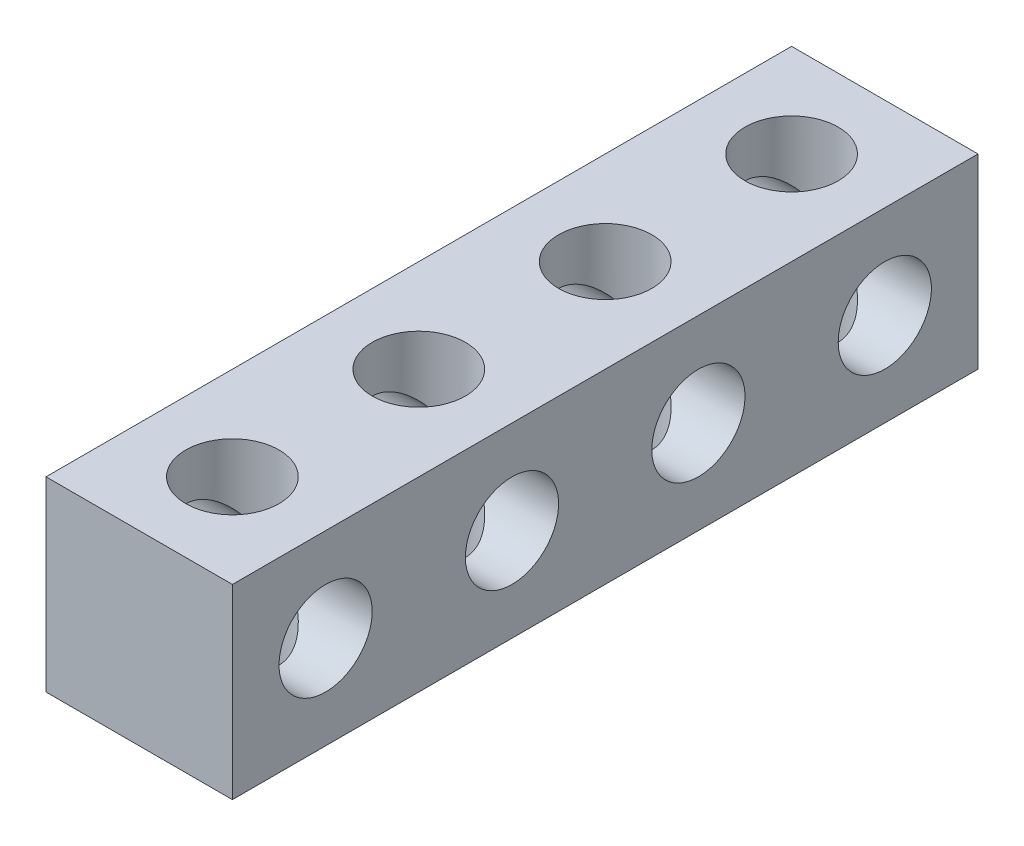
ISO-10303-21;
HEADER;
FILE_DESCRIPTION(('STEP AP214'),'2;1');
FILE_NAME('part.step','',(''),(''),'','','');
FILE_SCHEMA(('AUTOMOTIVE_DESIGN { 1 0 10303 214 1 1 1 1 }'));
ENDSEC;
DATA;
#1=APPLICATION_CONTEXT('core data for automotive mechanical design processes');
#2=APPLICATION_PROTOCOL_DEFINITION('international standard','automotive_design',2000,#1);
#3=PRODUCT_CONTEXT('',#1,'mechanical');
#4=PRODUCT('Part','Part','',(#3));
#5=PRODUCT_RELATED_PRODUCT_CATEGORY('part','',(#4));
#6=PRODUCT_DEFINITION_FORMATION('','',#4);
#7=PRODUCT_DEFINITION_CONTEXT('part definition',#1,'design');
#8=PRODUCT_DEFINITION('design','',#6,#7);
#9=PRODUCT_DEFINITION_SHAPE('','',#8);
#10=(LENGTH_UNIT() NAMED_UNIT(*) SI_UNIT(.MILLI.,.METRE.));
#11=(NAMED_UNIT(*) PLANE_ANGLE_UNIT() SI_UNIT($,.RADIAN.));
#12=(NAMED_UNIT(*) SI_UNIT($,.STERADIAN.) SOLID_ANGLE_UNIT());
#13=UNCERTAINTY_MEASURE_WITH_UNIT(LENGTH_MEASURE(1.E-05),#10,'distance_accuracy_value','');
#14=(GEOMETRIC_REPRESENTATION_CONTEXT(3) GLOBAL_UNCERTAINTY_ASSIGNED_CONTEXT((#13)) GLOBAL_UNIT_ASSIGNED_CONTEXT((#10,
#11,#12)) REPRESENTATION_CONTEXT('',''));
#15=CARTESIAN_POINT('',(0.,0.,0.));
#16=DIRECTION('',(0.,0.,1.));
#17=DIRECTION('',(1.,0.,0.));
#18=AXIS2_PLACEMENT_3D('',#15,#16,#17);
#19=CARTESIAN_POINT('',(0.,-6.35,-19.05));
#20=DIRECTION('',(0.,1.,0.));
#21=DIRECTION('',(0.,0.,1.));
#22=AXIS2_PLACEMENT_3D('',#19,#20,#21);
#23=CYLINDRICAL_SURFACE('',#22,3.175);
#24=CARTESIAN_POINT('',(0.,6.35,-19.05));
#25=DIRECTION('',(0.,1.,0.));
#26=DIRECTION('',(0.,0.,1.));
#27=AXIS2_PLACEMENT_3D('',#24,#25,#26);
#28=CIRCLE('',#27,3.175);
#29=CARTESIAN_POINT('',(0.,6.35,-15.875));
#30=VERTEX_POINT('',#29);
#31=EDGE_CURVE('E201',#30,#30,#28,.T.);
#32=ORIENTED_EDGE('',*,*,#31,.T.);
#33=EDGE_LOOP('',(#32));
#34=FACE_BOUND('',#33,.T.);
#35=CARTESIAN_POINT('',(0.,-2.66165465791143E-13,-19.05));
#36=DIRECTION('',(0.707106781186547,0.707106781186547,0.));
#37=DIRECTION('',(-0.707106781186547,0.707106781186547,0.));
#38=AXIS2_PLACEMENT_3D('',#35,#36,#37);
#39=ELLIPSE('',#38,4.49012806053457,3.175);
#40=CARTESIAN_POINT('',(0.,-2.66165465791143E-13,-15.875));
#41=VERTEX_POINT('',#40);
#42=CARTESIAN_POINT('',(0.,-2.66165465791143E-13,-22.225));
#43=VERTEX_POINT('',#42);
#44=EDGE_CURVE('E46',#41,#43,#39,.F.);
#45=ORIENTED_EDGE('',*,*,#44,.T.);
#46=CARTESIAN_POINT('',(0.,-2.66165465791143E-13,-19.05));
#47=DIRECTION('',(-0.707106781186547,0.707106781186547,0.));
#48=DIRECTION('',(0.707106781186547,0.707106781186547,0.));
#49=AXIS2_PLACEMENT_3D('',#46,#47,#48);
#50=ELLIPSE('',#49,4.49012806053457,3.175);
#51=EDGE_CURVE('E11',#43,#41,#50,.F.);
#52=ORIENTED_EDGE('',*,*,#51,.T.);
#53=EDGE_LOOP('',(#45,#52));
#54=FACE_BOUND('',#53,.T.);
#55=ADVANCED_FACE('F33',(#34,#54),#23,.F.);
#56=CARTESIAN_POINT('',(2.66050878019847E-13,-6.35,6.35));
#57=DIRECTION('',(0.,1.,0.));
#58=DIRECTION('',(0.,0.,1.));
#59=AXIS2_PLACEMENT_3D('',#56,#57,#58);
#60=CYLINDRICAL_SURFACE('',#59,3.175);
#61=CARTESIAN_POINT('',(2.66050878019847E-13,6.35,6.35));
#62=DIRECTION('',(0.,1.,0.));
#63=DIRECTION('',(0.,0.,1.));
#64=AXIS2_PLACEMENT_3D('',#61,#62,#63);
#65=CIRCLE('',#64,3.175);
#66=CARTESIAN_POINT('',(2.66050878019847E-13,6.35,9.525));
#67=VERTEX_POINT('',#66);
#68=EDGE_CURVE('E194',#67,#67,#65,.T.);
#69=ORIENTED_EDGE('',*,*,#68,.T.);
#70=EDGE_LOOP('',(#69));
#71=FACE_BOUND('',#70,.T.);
#72=CARTESIAN_POINT('',(2.66165465791143E-13,0.,6.35));
#73=DIRECTION('',(0.707106781186547,0.707106781186547,0.));
#74=DIRECTION('',(-0.707106781186547,0.707106781186547,0.));
#75=AXIS2_PLACEMENT_3D('',#72,#73,#74);
#76=ELLIPSE('',#75,4.49012806053457,3.175);
#77=CARTESIAN_POINT('',(2.66165465791143E-13,0.,9.525));
#78=VERTEX_POINT('',#77);
#79=CARTESIAN_POINT('',(2.66165465791143E-13,0.,3.175));
#80=VERTEX_POINT('',#79);
#81=EDGE_CURVE('E53',#78,#80,#76,.F.);
#82=ORIENTED_EDGE('',*,*,#81,.T.);
#83=CARTESIAN_POINT('',(2.66165465791143E-13,0.,6.35));
#84=DIRECTION('',(-0.707106781186547,0.707106781186547,0.));
#85=DIRECTION('',(0.707106781186547,0.707106781186547,0.));
#86=AXIS2_PLACEMENT_3D('',#83,#84,#85);
#87=ELLIPSE('',#86,4.49012806053457,3.175);
#88=EDGE_CURVE('E128',#80,#78,#87,.F.);
#89=ORIENTED_EDGE('',*,*,#88,.T.);
#90=EDGE_LOOP('',(#82,#89));
#91=FACE_BOUND('',#90,.T.);
#92=ADVANCED_FACE('F143',(#71,#91),#60,.F.);
#93=CARTESIAN_POINT('',(1.33025439009923E-13,-6.35,-6.35));
#94=DIRECTION('',(0.,1.,0.));
#95=DIRECTION('',(0.,0.,1.));
#96=AXIS2_PLACEMENT_3D('',#93,#94,#95);
#97=CYLINDRICAL_SURFACE('',#96,3.175);
#98=CARTESIAN_POINT('',(1.33025439009923E-13,6.35,-6.35));
#99=DIRECTION('',(0.,1.,0.));
#100=DIRECTION('',(0.,0.,1.));
#101=AXIS2_PLACEMENT_3D('',#98,#99,#100);
#102=CIRCLE('',#101,3.175);
#103=CARTESIAN_POINT('',(1.33025439009923E-13,6.35,-3.175));
#104=VERTEX_POINT('',#103);
#105=EDGE_CURVE('E190',#104,#104,#102,.T.);
#106=ORIENTED_EDGE('',*,*,#105,.T.);
#107=EDGE_LOOP('',(#106));
#108=FACE_BOUND('',#107,.T.);
#109=CARTESIAN_POINT('',(1.32865892461075E-13,-1.77154523281433E-13,-6.35));
#110=DIRECTION('',(0.707106781186547,0.707106781186547,0.));
#111=DIRECTION('',(-0.707106781186547,0.707106781186547,0.));
#112=AXIS2_PLACEMENT_3D('',#109,#110,#111);
#113=ELLIPSE('',#112,4.49012806053457,3.175);
#114=CARTESIAN_POINT('',(1.32865892461075E-13,-1.77154523281433E-13,-3.175));
#115=VERTEX_POINT('',#114);
#116=CARTESIAN_POINT('',(1.32865892461075E-13,-1.77154523281433E-13,-9.525));
#117=VERTEX_POINT('',#116);
#118=EDGE_CURVE('E107',#115,#117,#113,.F.);
#119=ORIENTED_EDGE('',*,*,#118,.T.);
#120=CARTESIAN_POINT('',(1.32865892461075E-13,-1.77154523281433E-13,-6.35));
#121=DIRECTION('',(-0.707106781186547,0.707106781186547,0.));
#122=DIRECTION('',(0.707106781186547,0.707106781186547,0.));
#123=AXIS2_PLACEMENT_3D('',#120,#121,#122);
#124=ELLIPSE('',#123,4.49012806053457,3.175);
#125=EDGE_CURVE('E103',#117,#115,#124,.F.);
#126=ORIENTED_EDGE('',*,*,#125,.T.);
#127=EDGE_LOOP('',(#119,#126));
#128=FACE_BOUND('',#127,.T.);
#129=ADVANCED_FACE('F115',(#108,#128),#97,.F.);
#130=CARTESIAN_POINT('',(3.9907631702977E-13,-6.35,19.05));
#131=DIRECTION('',(0.,1.,0.));
#132=DIRECTION('',(0.,0.,1.));
#133=AXIS2_PLACEMENT_3D('',#130,#131,#132);
#134=CYLINDRICAL_SURFACE('',#133,3.175);
#135=CARTESIAN_POINT('',(3.9907631702977E-13,6.35,19.05));
#136=DIRECTION('',(0.,1.,0.));
#137=DIRECTION('',(0.,0.,1.));
#138=AXIS2_PLACEMENT_3D('',#135,#136,#137);
#139=CIRCLE('',#138,3.175);
#140=CARTESIAN_POINT('',(3.9907631702977E-13,6.35,22.225));
#141=VERTEX_POINT('',#140);
#142=EDGE_CURVE('E198',#141,#141,#139,.T.);
#143=ORIENTED_EDGE('',*,*,#142,.T.);
#144=EDGE_LOOP('',(#143));
#145=FACE_BOUND('',#144,.T.);
#146=CARTESIAN_POINT('',(3.99031358252218E-13,0.,19.05));
#147=DIRECTION('',(0.707106781186547,0.707106781186547,0.));
#148=DIRECTION('',(-0.707106781186547,0.707106781186547,0.));
#149=AXIS2_PLACEMENT_3D('',#146,#147,#148);
#150=ELLIPSE('',#149,4.49012806053457,3.175);
#151=CARTESIAN_POINT('',(3.99031358252218E-13,0.,22.225));
#152=VERTEX_POINT('',#151);
#153=CARTESIAN_POINT('',(3.99031358252218E-13,0.,15.875));
#154=VERTEX_POINT('',#153);
#155=EDGE_CURVE('E234',#152,#154,#150,.F.);
#156=ORIENTED_EDGE('',*,*,#155,.T.);
#157=CARTESIAN_POINT('',(3.99031358252218E-13,0.,19.05));
#158=DIRECTION('',(-0.707106781186547,0.707106781186547,0.));
#159=DIRECTION('',(0.707106781186547,0.707106781186547,0.));
#160=AXIS2_PLACEMENT_3D('',#157,#158,#159);
#161=ELLIPSE('',#160,4.49012806053457,3.175);
#162=EDGE_CURVE('E113',#154,#152,#161,.F.);
#163=ORIENTED_EDGE('',*,*,#162,.T.);
#164=EDGE_LOOP('',(#156,#163));
#165=FACE_BOUND('',#164,.T.);
#166=ADVANCED_FACE('F163',(#145,#165),#134,.F.);
#167=CARTESIAN_POINT('',(6.35,-6.35,25.4));
#168=DIRECTION('',(-1.,0.,0.));
#169=DIRECTION('',(0.,0.,1.));
#170=AXIS2_PLACEMENT_3D('',#167,#168,#169);
#171=PLANE('',#170);
#172=CARTESIAN_POINT('',(6.35,0.,6.35));
#173=DIRECTION('',(-1.,0.,0.));
#174=DIRECTION('',(0.,0.,1.));
#175=AXIS2_PLACEMENT_3D('',#172,#173,#174);
#176=CIRCLE('',#175,3.175);
#177=CARTESIAN_POINT('',(6.35,0.,9.525));
#178=VERTEX_POINT('',#177);
#179=EDGE_CURVE('E303',#178,#178,#176,.T.);
#180=ORIENTED_EDGE('',*,*,#179,.T.);
#181=EDGE_LOOP('',(#180));
#182=FACE_BOUND('',#181,.T.);
#183=CARTESIAN_POINT('',(6.35,-1.77367252013231E-13,-6.35));
#184=DIRECTION('',(-1.,0.,0.));
#185=DIRECTION('',(0.,0.,1.));
#186=AXIS2_PLACEMENT_3D('',#183,#184,#185);
#187=CIRCLE('',#186,3.175);
#188=CARTESIAN_POINT('',(6.35,-1.77367252013231E-13,-3.175));
#189=VERTEX_POINT('',#188);
#190=EDGE_CURVE('E315',#189,#189,#187,.T.);
#191=ORIENTED_EDGE('',*,*,#190,.T.);
#192=EDGE_LOOP('',(#191));
#193=FACE_BOUND('',#192,.T.);
#194=CARTESIAN_POINT('',(6.35,-2.66050878019847E-13,-19.05));
#195=DIRECTION('',(-1.,0.,0.));
#196=DIRECTION('',(0.,0.,1.));
#197=AXIS2_PLACEMENT_3D('',#194,#195,#196);
#198=CIRCLE('',#197,3.175);
#199=CARTESIAN_POINT('',(6.35,-2.66050878019847E-13,-15.875));
#200=VERTEX_POINT('',#199);
#201=EDGE_CURVE('E309',#200,#200,#198,.T.);
#202=ORIENTED_EDGE('',*,*,#201,.T.);
#203=EDGE_LOOP('',(#202));
#204=FACE_BOUND('',#203,.T.);
#205=CARTESIAN_POINT('',(6.35,0.,19.05));
#206=DIRECTION('',(-1.,0.,0.));
#207=DIRECTION('',(0.,0.,1.));
#208=AXIS2_PLACEMENT_3D('',#205,#206,#207);
#209=CIRCLE('',#208,3.175);
#210=CARTESIAN_POINT('',(6.35,0.,22.225));
#211=VERTEX_POINT('',#210);
#212=EDGE_CURVE('E283',#211,#211,#209,.T.);
#213=ORIENTED_EDGE('',*,*,#212,.T.);
#214=EDGE_LOOP('',(#213));
#215=FACE_BOUND('',#214,.T.);
#216=DIRECTION('',(0.,1.,0.));
#217=VECTOR('',#216,1.);
#218=CARTESIAN_POINT('',(6.35,-6.35,-25.4));
#219=LINE('',#218,#217);
#220=CARTESIAN_POINT('',(6.35,-6.35,-25.4));
#221=VERTEX_POINT('',#220);
#222=CARTESIAN_POINT('',(6.35,6.35,-25.4));
#223=VERTEX_POINT('',#222);
#224=EDGE_CURVE('E213',#221,#223,#219,.T.);
#225=ORIENTED_EDGE('',*,*,#224,.T.);
#226=DIRECTION('',(0.,0.,-1.));
#227=VECTOR('',#226,1.);
#228=CARTESIAN_POINT('',(6.35,6.35,25.4));
#229=LINE('',#228,#227);
#230=CARTESIAN_POINT('',(6.35,6.35,25.4));
#231=VERTEX_POINT('',#230);
#232=EDGE_CURVE('E209',#231,#223,#229,.T.);
#233=ORIENTED_EDGE('',*,*,#232,.F.);
#234=DIRECTION('',(0.,1.,0.));
#235=VECTOR('',#234,1.);
#236=CARTESIAN_POINT('',(6.35,-6.35,25.4));
#237=LINE('',#236,#235);
#238=CARTESIAN_POINT('',(6.35,-6.35,25.4));
#239=VERTEX_POINT('',#238);
#240=EDGE_CURVE('E224',#239,#231,#237,.T.);
#241=ORIENTED_EDGE('',*,*,#240,.F.);
#242=DIRECTION('',(0.,0.,-1.));
#243=VECTOR('',#242,1.);
#244=CARTESIAN_POINT('',(6.35,-6.35,25.4));
#245=LINE('',#244,#243);
#246=EDGE_CURVE('E228',#239,#221,#245,.T.);
#247=ORIENTED_EDGE('',*,*,#246,.T.);
#248=EDGE_LOOP('',(#225,#233,#241,#247));
#249=FACE_BOUND('',#248,.T.);
#250=ADVANCED_FACE('F35',(#182,#193,#204,#215,#249),#171,.F.);
#251=CARTESIAN_POINT('',(-6.35,6.35,25.4));
#252=DIRECTION('',(0.,-1.,0.));
#253=DIRECTION('',(0.,0.,-1.));
#254=AXIS2_PLACEMENT_3D('',#251,#252,#253);
#255=PLANE('',#254);
#256=ORIENTED_EDGE('',*,*,#105,.F.);
#257=EDGE_LOOP('',(#256));
#258=FACE_BOUND('',#257,.T.);
#259=ORIENTED_EDGE('',*,*,#68,.F.);
#260=EDGE_LOOP('',(#259));
#261=FACE_BOUND('',#260,.T.);
#262=ORIENTED_EDGE('',*,*,#142,.F.);
#263=EDGE_LOOP('',(#262));
#264=FACE_BOUND('',#263,.T.);
#265=ORIENTED_EDGE('',*,*,#31,.F.);
#266=EDGE_LOOP('',(#265));
#267=FACE_BOUND('',#266,.T.);
#268=DIRECTION('',(-1.,0.,0.));
#269=VECTOR('',#268,1.);
#270=CARTESIAN_POINT('',(-6.35,6.35,-25.4));
#271=LINE('',#270,#269);
#272=CARTESIAN_POINT('',(-6.35,6.35,-25.4));
#273=VERTEX_POINT('',#272);
#274=EDGE_CURVE('E204',#223,#273,#271,.T.);
#275=ORIENTED_EDGE('',*,*,#274,.T.);
#276=DIRECTION('',(0.,0.,-1.));
#277=VECTOR('',#276,1.);
#278=CARTESIAN_POINT('',(-6.35,6.35,25.4));
#279=LINE('',#278,#277);
#280=CARTESIAN_POINT('',(-6.35,6.35,25.4));
#281=VERTEX_POINT('',#280);
#282=EDGE_CURVE('E206',#281,#273,#279,.T.);
#283=ORIENTED_EDGE('',*,*,#282,.F.);
#284=DIRECTION('',(-1.,0.,0.));
#285=VECTOR('',#284,1.);
#286=CARTESIAN_POINT('',(-6.35,6.35,25.4));
#287=LINE('',#286,#285);
#288=EDGE_CURVE('E290',#231,#281,#287,.T.);
#289=ORIENTED_EDGE('',*,*,#288,.F.);
#290=ORIENTED_EDGE('',*,*,#232,.T.);
#291=EDGE_LOOP('',(#275,#283,#289,#290));
#292=FACE_BOUND('',#291,.T.);
#293=ADVANCED_FACE('F179',(#258,#261,#264,#267,#292),#255,.F.);
#294=CARTESIAN_POINT('',(-6.35,-6.35,25.4));
#295=DIRECTION('',(1.,0.,0.));
#296=DIRECTION('',(0.,0.,-1.));
#297=AXIS2_PLACEMENT_3D('',#294,#295,#296);
#298=PLANE('',#297);
#299=CARTESIAN_POINT('',(-6.35,0.,6.35));
#300=DIRECTION('',(-1.,0.,0.));
#301=DIRECTION('',(0.,0.,1.));
#302=AXIS2_PLACEMENT_3D('',#299,#300,#301);
#303=CIRCLE('',#302,3.175);
#304=CARTESIAN_POINT('',(-6.35,0.,9.525));
#305=VERTEX_POINT('',#304);
#306=EDGE_CURVE('E318',#305,#305,#303,.T.);
#307=ORIENTED_EDGE('',*,*,#306,.F.);
#308=EDGE_LOOP('',(#307));
#309=FACE_BOUND('',#308,.T.);
#310=CARTESIAN_POINT('',(-6.35,-1.77367252013231E-13,-6.35));
#311=DIRECTION('',(-1.,0.,0.));
#312=DIRECTION('',(0.,0.,1.));
#313=AXIS2_PLACEMENT_3D('',#310,#311,#312);
#314=CIRCLE('',#313,3.175);
#315=CARTESIAN_POINT('',(-6.35,-1.77367252013231E-13,-3.175));
#316=VERTEX_POINT('',#315);
#317=EDGE_CURVE('E312',#316,#316,#314,.T.);
#318=ORIENTED_EDGE('',*,*,#317,.F.);
#319=EDGE_LOOP('',(#318));
#320=FACE_BOUND('',#319,.T.);
#321=CARTESIAN_POINT('',(-6.35,-2.66050878019847E-13,-19.05));
#322=DIRECTION('',(-1.,0.,0.));
#323=DIRECTION('',(0.,0.,1.));
#324=AXIS2_PLACEMENT_3D('',#321,#322,#323);
#325=CIRCLE('',#324,3.175);
#326=CARTESIAN_POINT('',(-6.35,-2.66050878019847E-13,-15.875));
#327=VERTEX_POINT('',#326);
#328=EDGE_CURVE('E306',#327,#327,#325,.T.);
#329=ORIENTED_EDGE('',*,*,#328,.F.);
#330=EDGE_LOOP('',(#329));
#331=FACE_BOUND('',#330,.T.);
#332=CARTESIAN_POINT('',(-6.35,0.,19.05));
#333=DIRECTION('',(-1.,0.,0.));
#334=DIRECTION('',(0.,0.,1.));
#335=AXIS2_PLACEMENT_3D('',#332,#333,#334);
#336=CIRCLE('',#335,3.175);
#337=CARTESIAN_POINT('',(-6.35,0.,22.225));
#338=VERTEX_POINT('',#337);
#339=EDGE_CURVE('E301',#338,#338,#336,.T.);
#340=ORIENTED_EDGE('',*,*,#339,.F.);
#341=EDGE_LOOP('',(#340));
#342=FACE_BOUND('',#341,.T.);
#343=DIRECTION('',(0.,-1.,0.));
#344=VECTOR('',#343,1.);
#345=CARTESIAN_POINT('',(-6.35,-6.35,-25.4));
#346=LINE('',#345,#344);
#347=CARTESIAN_POINT('',(-6.35,-6.35,-25.4));
#348=VERTEX_POINT('',#347);
#349=EDGE_CURVE('E212',#273,#348,#346,.T.);
#350=ORIENTED_EDGE('',*,*,#349,.T.);
#351=DIRECTION('',(0.,0.,-1.));
#352=VECTOR('',#351,1.);
#353=CARTESIAN_POINT('',(-6.35,-6.35,25.4));
#354=LINE('',#353,#352);
#355=CARTESIAN_POINT('',(-6.35,-6.35,25.4));
#356=VERTEX_POINT('',#355);
#357=EDGE_CURVE('E219',#356,#348,#354,.T.);
#358=ORIENTED_EDGE('',*,*,#357,.F.);
#359=DIRECTION('',(0.,-1.,0.));
#360=VECTOR('',#359,1.);
#361=CARTESIAN_POINT('',(-6.35,-6.35,25.4));
#362=LINE('',#361,#360);
#363=EDGE_CURVE('E218',#281,#356,#362,.T.);
#364=ORIENTED_EDGE('',*,*,#363,.F.);
#365=ORIENTED_EDGE('',*,*,#282,.T.);
#366=EDGE_LOOP('',(#350,#358,#364,#365));
#367=FACE_BOUND('',#366,.T.);
#368=ADVANCED_FACE('F176',(#309,#320,#331,#342,#367),#298,.F.);
#369=CARTESIAN_POINT('',(-6.35,-6.35,25.4));
#370=DIRECTION('',(0.,1.,0.));
#371=DIRECTION('',(0.,0.,1.));
#372=AXIS2_PLACEMENT_3D('',#369,#370,#371);
#373=PLANE('',#372);
#374=CARTESIAN_POINT('',(1.33025439009923E-13,-6.35,-6.35));
#375=DIRECTION('',(0.,1.,0.));
#376=DIRECTION('',(0.,0.,1.));
#377=AXIS2_PLACEMENT_3D('',#374,#375,#376);
#378=CIRCLE('',#377,3.175);
#379=CARTESIAN_POINT('',(1.33025439009923E-13,-6.35,-3.175));
#380=VERTEX_POINT('',#379);
#381=EDGE_CURVE('E274',#380,#380,#378,.T.);
#382=ORIENTED_EDGE('',*,*,#381,.T.);
#383=EDGE_LOOP('',(#382));
#384=FACE_BOUND('',#383,.T.);
#385=CARTESIAN_POINT('',(2.66050878019847E-13,-6.35,6.35));
#386=DIRECTION('',(0.,1.,0.));
#387=DIRECTION('',(0.,0.,1.));
#388=AXIS2_PLACEMENT_3D('',#385,#386,#387);
#389=CIRCLE('',#388,3.175);
#390=CARTESIAN_POINT('',(2.66050878019847E-13,-6.35,9.525));
#391=VERTEX_POINT('',#390);
#392=EDGE_CURVE('E271',#391,#391,#389,.T.);
#393=ORIENTED_EDGE('',*,*,#392,.T.);
#394=EDGE_LOOP('',(#393));
#395=FACE_BOUND('',#394,.T.);
#396=CARTESIAN_POINT('',(3.9907631702977E-13,-6.35,19.05));
#397=DIRECTION('',(0.,1.,0.));
#398=DIRECTION('',(0.,0.,1.));
#399=AXIS2_PLACEMENT_3D('',#396,#397,#398);
#400=CIRCLE('',#399,3.175);
#401=CARTESIAN_POINT('',(3.9907631702977E-13,-6.35,22.225));
#402=VERTEX_POINT('',#401);
#403=EDGE_CURVE('E276',#402,#402,#400,.T.);
#404=ORIENTED_EDGE('',*,*,#403,.T.);
#405=EDGE_LOOP('',(#404));
#406=FACE_BOUND('',#405,.T.);
#407=CARTESIAN_POINT('',(0.,-6.35,-19.05));
#408=DIRECTION('',(0.,1.,0.));
#409=DIRECTION('',(0.,0.,1.));
#410=AXIS2_PLACEMENT_3D('',#407,#408,#409);
#411=CIRCLE('',#410,3.175);
#412=CARTESIAN_POINT('',(0.,-6.35,-15.875));
#413=VERTEX_POINT('',#412);
#414=EDGE_CURVE('E284',#413,#413,#411,.T.);
#415=ORIENTED_EDGE('',*,*,#414,.T.);
#416=EDGE_LOOP('',(#415));
#417=FACE_BOUND('',#416,.T.);
#418=DIRECTION('',(1.,0.,0.));
#419=VECTOR('',#418,1.);
#420=CARTESIAN_POINT('',(-6.35,-6.35,-25.4));
#421=LINE('',#420,#419);
#422=EDGE_CURVE('E222',#348,#221,#421,.T.);
#423=ORIENTED_EDGE('',*,*,#422,.T.);
#424=ORIENTED_EDGE('',*,*,#246,.F.);
#425=DIRECTION('',(1.,0.,0.));
#426=VECTOR('',#425,1.);
#427=CARTESIAN_POINT('',(-6.35,-6.35,25.4));
#428=LINE('',#427,#426);
#429=EDGE_CURVE('E231',#356,#239,#428,.T.);
#430=ORIENTED_EDGE('',*,*,#429,.F.);
#431=ORIENTED_EDGE('',*,*,#357,.T.);
#432=EDGE_LOOP('',(#423,#424,#430,#431));
#433=FACE_BOUND('',#432,.T.);
#434=ADVANCED_FACE('F170',(#384,#395,#406,#417,#433),#373,.F.);
#435=CARTESIAN_POINT('',(0.,0.,25.4));
#436=DIRECTION('',(0.,0.,-1.));
#437=DIRECTION('',(-1.,0.,0.));
#438=AXIS2_PLACEMENT_3D('',#435,#436,#437);
#439=PLANE('',#438);
#440=ORIENTED_EDGE('',*,*,#240,.T.);
#441=ORIENTED_EDGE('',*,*,#288,.T.);
#442=ORIENTED_EDGE('',*,*,#363,.T.);
#443=ORIENTED_EDGE('',*,*,#429,.T.);
#444=EDGE_LOOP('',(#440,#441,#442,#443));
#445=FACE_BOUND('',#444,.T.);
#446=ADVANCED_FACE('F164',(#445),#439,.F.);
#447=CARTESIAN_POINT('',(0.,0.,-25.4));
#448=DIRECTION('',(0.,0.,-1.));
#449=DIRECTION('',(-1.,0.,0.));
#450=AXIS2_PLACEMENT_3D('',#447,#448,#449);
#451=PLANE('',#450);
#452=ORIENTED_EDGE('',*,*,#224,.F.);
#453=ORIENTED_EDGE('',*,*,#422,.F.);
#454=ORIENTED_EDGE('',*,*,#349,.F.);
#455=ORIENTED_EDGE('',*,*,#274,.F.);
#456=EDGE_LOOP('',(#452,#453,#454,#455));
#457=FACE_BOUND('',#456,.T.);
#458=ADVANCED_FACE('F157',(#457),#451,.T.);
#459=CARTESIAN_POINT('',(0.,-2.66165465791143E-13,-19.05));
#460=DIRECTION('',(0.707106781186547,0.707106781186547,0.));
#461=DIRECTION('',(-0.707106781186547,0.707106781186547,0.));
#462=AXIS2_PLACEMENT_3D('',#459,#460,#461);
#463=ELLIPSE('',#462,4.49012806053457,3.175);
#464=EDGE_CURVE('E131',#41,#43,#463,.T.);
#465=ORIENTED_EDGE('',*,*,#464,.T.);
#466=CARTESIAN_POINT('',(0.,-2.66165465791143E-13,-19.05));
#467=DIRECTION('',(-0.707106781186547,0.707106781186547,0.));
#468=DIRECTION('',(0.707106781186547,0.707106781186547,0.));
#469=AXIS2_PLACEMENT_3D('',#466,#467,#468);
#470=ELLIPSE('',#469,4.49012806053457,3.175);
#471=EDGE_CURVE('E41',#43,#41,#470,.T.);
#472=ORIENTED_EDGE('',*,*,#471,.T.);
#473=EDGE_LOOP('',(#465,#472));
#474=FACE_BOUND('',#473,.T.);
#475=ORIENTED_EDGE('',*,*,#414,.F.);
#476=EDGE_LOOP('',(#475));
#477=FACE_BOUND('',#476,.T.);
#478=ADVANCED_FACE('F135',(#474,#477),#23,.F.);
#479=CARTESIAN_POINT('',(3.99031358252218E-13,0.,19.05));
#480=DIRECTION('',(0.707106781186547,0.707106781186547,0.));
#481=DIRECTION('',(-0.707106781186547,0.707106781186547,0.));
#482=AXIS2_PLACEMENT_3D('',#479,#480,#481);
#483=ELLIPSE('',#482,4.49012806053457,3.175);
#484=EDGE_CURVE('E236',#152,#154,#483,.T.);
#485=ORIENTED_EDGE('',*,*,#484,.T.);
#486=CARTESIAN_POINT('',(3.99031358252218E-13,0.,19.05));
#487=DIRECTION('',(-0.707106781186547,0.707106781186547,0.));
#488=DIRECTION('',(0.707106781186547,0.707106781186547,0.));
#489=AXIS2_PLACEMENT_3D('',#486,#487,#488);
#490=ELLIPSE('',#489,4.49012806053457,3.175);
#491=EDGE_CURVE('E239',#154,#152,#490,.T.);
#492=ORIENTED_EDGE('',*,*,#491,.T.);
#493=EDGE_LOOP('',(#485,#492));
#494=FACE_BOUND('',#493,.T.);
#495=ORIENTED_EDGE('',*,*,#403,.F.);
#496=EDGE_LOOP('',(#495));
#497=FACE_BOUND('',#496,.T.);
#498=ADVANCED_FACE('F156',(#494,#497),#134,.F.);
#499=CARTESIAN_POINT('',(2.66165465791143E-13,0.,6.35));
#500=DIRECTION('',(0.707106781186547,0.707106781186547,0.));
#501=DIRECTION('',(-0.707106781186547,0.707106781186547,0.));
#502=AXIS2_PLACEMENT_3D('',#499,#500,#501);
#503=ELLIPSE('',#502,4.49012806053457,3.175);
#504=EDGE_CURVE('E122',#78,#80,#503,.T.);
#505=ORIENTED_EDGE('',*,*,#504,.T.);
#506=CARTESIAN_POINT('',(2.66165465791143E-13,0.,6.35));
#507=DIRECTION('',(-0.707106781186547,0.707106781186547,0.));
#508=DIRECTION('',(0.707106781186547,0.707106781186547,0.));
#509=AXIS2_PLACEMENT_3D('',#506,#507,#508);
#510=ELLIPSE('',#509,4.49012806053457,3.175);
#511=EDGE_CURVE('E125',#80,#78,#510,.T.);
#512=ORIENTED_EDGE('',*,*,#511,.T.);
#513=EDGE_LOOP('',(#505,#512));
#514=FACE_BOUND('',#513,.T.);
#515=ORIENTED_EDGE('',*,*,#392,.F.);
#516=EDGE_LOOP('',(#515));
#517=FACE_BOUND('',#516,.T.);
#518=ADVANCED_FACE('F151',(#514,#517),#60,.F.);
#519=CARTESIAN_POINT('',(1.32865892461075E-13,-1.77154523281433E-13,-6.35));
#520=DIRECTION('',(0.707106781186547,0.707106781186547,0.));
#521=DIRECTION('',(-0.707106781186547,0.707106781186547,0.));
#522=AXIS2_PLACEMENT_3D('',#519,#520,#521);
#523=ELLIPSE('',#522,4.49012806053457,3.175);
#524=EDGE_CURVE('E99',#115,#117,#523,.T.);
#525=ORIENTED_EDGE('',*,*,#524,.T.);
#526=CARTESIAN_POINT('',(1.32865892461075E-13,-1.77154523281433E-13,-6.35));
#527=DIRECTION('',(-0.707106781186547,0.707106781186547,0.));
#528=DIRECTION('',(0.707106781186547,0.707106781186547,0.));
#529=AXIS2_PLACEMENT_3D('',#526,#527,#528);
#530=ELLIPSE('',#529,4.49012806053457,3.175);
#531=EDGE_CURVE('E106',#117,#115,#530,.T.);
#532=ORIENTED_EDGE('',*,*,#531,.T.);
#533=EDGE_LOOP('',(#525,#532));
#534=FACE_BOUND('',#533,.T.);
#535=ORIENTED_EDGE('',*,*,#381,.F.);
#536=EDGE_LOOP('',(#535));
#537=FACE_BOUND('',#536,.T.);
#538=ADVANCED_FACE('F117',(#534,#537),#97,.F.);
#539=CARTESIAN_POINT('',(6.35,0.,19.05));
#540=DIRECTION('',(-1.,0.,0.));
#541=DIRECTION('',(0.,0.,1.));
#542=AXIS2_PLACEMENT_3D('',#539,#540,#541);
#543=CYLINDRICAL_SURFACE('',#542,3.175);
#544=ORIENTED_EDGE('',*,*,#339,.T.);
#545=EDGE_LOOP('',(#544));
#546=FACE_BOUND('',#545,.T.);
#547=ORIENTED_EDGE('',*,*,#155,.F.);
#548=ORIENTED_EDGE('',*,*,#491,.F.);
#549=EDGE_LOOP('',(#547,#548));
#550=FACE_BOUND('',#549,.T.);
#551=ADVANCED_FACE('F250',(#546,#550),#543,.F.);
#552=ORIENTED_EDGE('',*,*,#212,.F.);
#553=EDGE_LOOP('',(#552));
#554=FACE_BOUND('',#553,.T.);
#555=ORIENTED_EDGE('',*,*,#484,.F.);
#556=ORIENTED_EDGE('',*,*,#162,.F.);
#557=EDGE_LOOP('',(#555,#556));
#558=FACE_BOUND('',#557,.T.);
#559=ADVANCED_FACE('F252',(#554,#558),#543,.F.);
#560=CARTESIAN_POINT('',(6.35,-1.77367252013231E-13,-6.35));
#561=DIRECTION('',(-1.,0.,0.));
#562=DIRECTION('',(0.,0.,1.));
#563=AXIS2_PLACEMENT_3D('',#560,#561,#562);
#564=CYLINDRICAL_SURFACE('',#563,3.175);
#565=ORIENTED_EDGE('',*,*,#317,.T.);
#566=EDGE_LOOP('',(#565));
#567=FACE_BOUND('',#566,.T.);
#568=ORIENTED_EDGE('',*,*,#118,.F.);
#569=ORIENTED_EDGE('',*,*,#531,.F.);
#570=EDGE_LOOP('',(#568,#569));
#571=FACE_BOUND('',#570,.T.);
#572=ADVANCED_FACE('F111',(#567,#571),#564,.F.);
#573=ORIENTED_EDGE('',*,*,#190,.F.);
#574=EDGE_LOOP('',(#573));
#575=FACE_BOUND('',#574,.T.);
#576=ORIENTED_EDGE('',*,*,#524,.F.);
#577=ORIENTED_EDGE('',*,*,#125,.F.);
#578=EDGE_LOOP('',(#576,#577));
#579=FACE_BOUND('',#578,.T.);
#580=ADVANCED_FACE('F101',(#575,#579),#564,.F.);
#581=CARTESIAN_POINT('',(6.35,0.,6.35));
#582=DIRECTION('',(-1.,0.,0.));
#583=DIRECTION('',(0.,0.,1.));
#584=AXIS2_PLACEMENT_3D('',#581,#582,#583);
#585=CYLINDRICAL_SURFACE('',#584,3.175);
#586=ORIENTED_EDGE('',*,*,#306,.T.);
#587=EDGE_LOOP('',(#586));
#588=FACE_BOUND('',#587,.T.);
#589=ORIENTED_EDGE('',*,*,#81,.F.);
#590=ORIENTED_EDGE('',*,*,#511,.F.);
#591=EDGE_LOOP('',(#589,#590));
#592=FACE_BOUND('',#591,.T.);
#593=ADVANCED_FACE('F328',(#588,#592),#585,.F.);
#594=ORIENTED_EDGE('',*,*,#179,.F.);
#595=EDGE_LOOP('',(#594));
#596=FACE_BOUND('',#595,.T.);
#597=ORIENTED_EDGE('',*,*,#504,.F.);
#598=ORIENTED_EDGE('',*,*,#88,.F.);
#599=EDGE_LOOP('',(#597,#598));
#600=FACE_BOUND('',#599,.T.);
#601=ADVANCED_FACE('F325',(#596,#600),#585,.F.);
#602=CARTESIAN_POINT('',(6.35,-2.66050878019847E-13,-19.05));
#603=DIRECTION('',(-1.,0.,0.));
#604=DIRECTION('',(0.,0.,1.));
#605=AXIS2_PLACEMENT_3D('',#602,#603,#604);
#606=CYLINDRICAL_SURFACE('',#605,3.175);
#607=ORIENTED_EDGE('',*,*,#328,.T.);
#608=EDGE_LOOP('',(#607));
#609=FACE_BOUND('',#608,.T.);
#610=ORIENTED_EDGE('',*,*,#44,.F.);
#611=ORIENTED_EDGE('',*,*,#471,.F.);
#612=EDGE_LOOP('',(#610,#611));
#613=FACE_BOUND('',#612,.T.);
#614=ADVANCED_FACE('F139',(#609,#613),#606,.F.);
#615=ORIENTED_EDGE('',*,*,#201,.F.);
#616=EDGE_LOOP('',(#615));
#617=FACE_BOUND('',#616,.T.);
#618=ORIENTED_EDGE('',*,*,#464,.F.);
#619=ORIENTED_EDGE('',*,*,#51,.F.);
#620=EDGE_LOOP('',(#618,#619));
#621=FACE_BOUND('',#620,.T.);
#622=ADVANCED_FACE('F141',(#617,#621),#606,.F.);
#623=CLOSED_SHELL('',(#55,#92,#129,#166,#250,#293,#368,#434,#446,#458,#478,#498,#518,#538,#551,
#559,#572,#580,#593,#601,#614,#622));
#624=MANIFOLD_SOLID_BREP('B2',#623);
#625=ADVANCED_BREP_SHAPE_REPRESENTATION('',(#18,#624),#14);
#626=SHAPE_DEFINITION_REPRESENTATION(#9,#625);
ENDSEC;
END-ISO-10303-21;
